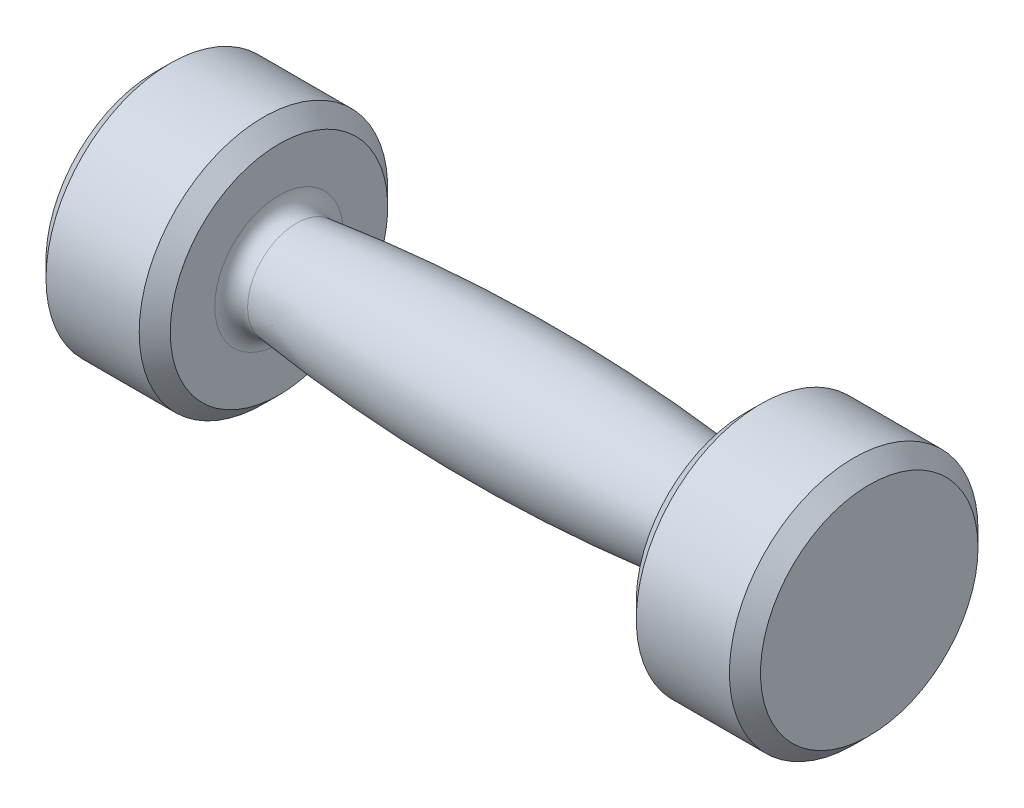
ISO-10303-21;
HEADER;
FILE_DESCRIPTION(('STEP AP214'),'2;1');
FILE_NAME('part.step','',(''),(''),'','','');
FILE_SCHEMA(('AUTOMOTIVE_DESIGN { 1 0 10303 214 1 1 1 1 }'));
ENDSEC;
DATA;
#1=APPLICATION_CONTEXT('core data for automotive mechanical design processes');
#2=APPLICATION_PROTOCOL_DEFINITION('international standard','automotive_design',2000,#1);
#3=PRODUCT_CONTEXT('',#1,'mechanical');
#4=PRODUCT('Part','Part','',(#3));
#5=PRODUCT_RELATED_PRODUCT_CATEGORY('part','',(#4));
#6=PRODUCT_DEFINITION_FORMATION('','',#4);
#7=PRODUCT_DEFINITION_CONTEXT('part definition',#1,'design');
#8=PRODUCT_DEFINITION('design','',#6,#7);
#9=PRODUCT_DEFINITION_SHAPE('','',#8);
#10=(LENGTH_UNIT() NAMED_UNIT(*) SI_UNIT(.MILLI.,.METRE.));
#11=(NAMED_UNIT(*) PLANE_ANGLE_UNIT() SI_UNIT($,.RADIAN.));
#12=(NAMED_UNIT(*) SI_UNIT($,.STERADIAN.) SOLID_ANGLE_UNIT());
#13=UNCERTAINTY_MEASURE_WITH_UNIT(LENGTH_MEASURE(1.E-05),#10,'distance_accuracy_value','');
#14=(GEOMETRIC_REPRESENTATION_CONTEXT(3) GLOBAL_UNCERTAINTY_ASSIGNED_CONTEXT((#13)) GLOBAL_UNIT_ASSIGNED_CONTEXT((#10,
#11,#12)) REPRESENTATION_CONTEXT('',''));
#15=CARTESIAN_POINT('',(0.,0.,0.));
#16=DIRECTION('',(0.,0.,1.));
#17=DIRECTION('',(1.,0.,0.));
#18=AXIS2_PLACEMENT_3D('',#15,#16,#17);
#19=CARTESIAN_POINT('',(75.,0.,0.));
#20=DIRECTION('',(1.,0.,0.));
#21=DIRECTION('',(0.,0.,-1.));
#22=AXIS2_PLACEMENT_3D('',#19,#20,#21);
#23=CYLINDRICAL_SURFACE('',#22,40.);
#24=CARTESIAN_POINT('',(110.,0.,0.));
#25=DIRECTION('',(1.,0.,0.));
#26=DIRECTION('',(0.,0.,-1.));
#27=AXIS2_PLACEMENT_3D('',#24,#25,#26);
#28=CIRCLE('',#27,40.);
#29=CARTESIAN_POINT('',(110.,0.,-40.));
#30=VERTEX_POINT('',#29);
#31=EDGE_CURVE('E59',#30,#30,#28,.F.);
#32=ORIENTED_EDGE('',*,*,#31,.T.);
#33=EDGE_LOOP('',(#32));
#34=FACE_BOUND('',#33,.T.);
#35=CARTESIAN_POINT('',(80.,0.,0.));
#36=DIRECTION('',(1.,0.,0.));
#37=DIRECTION('',(0.,0.,-1.));
#38=AXIS2_PLACEMENT_3D('',#35,#36,#37);
#39=CIRCLE('',#38,40.);
#40=CARTESIAN_POINT('',(80.,0.,-40.));
#41=VERTEX_POINT('',#40);
#42=EDGE_CURVE('E62',#41,#41,#39,.T.);
#43=ORIENTED_EDGE('',*,*,#42,.T.);
#44=EDGE_LOOP('',(#43));
#45=FACE_BOUND('',#44,.T.);
#46=ADVANCED_FACE('F35',(#34,#45),#23,.T.);
#47=CARTESIAN_POINT('',(75.,0.,0.));
#48=DIRECTION('',(1.,0.,0.));
#49=DIRECTION('',(0.,0.,-1.));
#50=AXIS2_PLACEMENT_3D('',#47,#48,#49);
#51=PLANE('',#50);
#52=CARTESIAN_POINT('',(75.,0.,0.));
#53=DIRECTION('',(1.,0.,0.));
#54=DIRECTION('',(0.,0.,-1.));
#55=AXIS2_PLACEMENT_3D('',#52,#53,#54);
#56=CIRCLE('',#55,35.);
#57=CARTESIAN_POINT('',(75.,0.,-35.));
#58=VERTEX_POINT('',#57);
#59=EDGE_CURVE('E56',#58,#58,#56,.F.);
#60=ORIENTED_EDGE('',*,*,#59,.T.);
#61=EDGE_LOOP('',(#60));
#62=FACE_BOUND('',#61,.T.);
#63=CARTESIAN_POINT('',(75.,0.,0.));
#64=DIRECTION('',(1.,0.,0.));
#65=DIRECTION('',(0.,0.,-1.));
#66=AXIS2_PLACEMENT_3D('',#63,#64,#65);
#67=CIRCLE('',#66,20.6854249492381);
#68=CARTESIAN_POINT('',(75.,0.,-20.6854249492381));
#69=VERTEX_POINT('',#68);
#70=EDGE_CURVE('E77',#69,#69,#67,.T.);
#71=ORIENTED_EDGE('',*,*,#70,.T.);
#72=EDGE_LOOP('',(#71));
#73=FACE_BOUND('',#72,.T.);
#74=ADVANCED_FACE('F81',(#62,#73),#51,.F.);
#75=CARTESIAN_POINT('',(115.,0.,0.));
#76=DIRECTION('',(1.,0.,0.));
#77=DIRECTION('',(0.,0.,-1.));
#78=AXIS2_PLACEMENT_3D('',#75,#76,#77);
#79=PLANE('',#78);
#80=CARTESIAN_POINT('',(115.,0.,0.));
#81=DIRECTION('',(1.,0.,0.));
#82=DIRECTION('',(0.,0.,-1.));
#83=AXIS2_PLACEMENT_3D('',#80,#81,#82);
#84=CIRCLE('',#83,35.);
#85=CARTESIAN_POINT('',(115.,0.,-35.));
#86=VERTEX_POINT('',#85);
#87=EDGE_CURVE('E65',#86,#86,#84,.T.);
#88=ORIENTED_EDGE('',*,*,#87,.T.);
#89=EDGE_LOOP('',(#88));
#90=FACE_BOUND('',#89,.T.);
#91=ADVANCED_FACE('F106',(#90),#79,.T.);
#92=CARTESIAN_POINT('',(0.,0.,0.));
#93=DIRECTION('',(1.,0.,0.));
#94=DIRECTION('',(0.,0.,-1.));
#95=AXIS2_PLACEMENT_3D('',#92,#93,#94);
#96=DEGENERATE_TOROIDAL_SURFACE('',#95,545.,565.,.F.);
#97=CARTESIAN_POINT('',(69.3859649122807,0.,0.));
#98=DIRECTION('',(-1.,0.,0.));
#99=DIRECTION('',(0.,0.,1.));
#100=AXIS2_PLACEMENT_3D('',#97,#98,#99);
#101=CIRCLE('',#100,15.7232720988061);
#102=CARTESIAN_POINT('',(69.3859649122807,0.,15.7232720988061));
#103=VERTEX_POINT('',#102);
#104=EDGE_CURVE('E71',#103,#103,#101,.T.);
#105=ORIENTED_EDGE('',*,*,#104,.T.);
#106=EDGE_LOOP('',(#105));
#107=FACE_BOUND('',#106,.T.);
#108=CARTESIAN_POINT('',(-69.3859649122807,0.,0.));
#109=DIRECTION('',(1.,0.,0.));
#110=DIRECTION('',(0.,0.,-1.));
#111=AXIS2_PLACEMENT_3D('',#108,#109,#110);
#112=CIRCLE('',#111,15.7232720988061);
#113=CARTESIAN_POINT('',(-69.3859649122807,0.,-15.7232720988061));
#114=VERTEX_POINT('',#113);
#115=EDGE_CURVE('E74',#114,#114,#112,.T.);
#116=ORIENTED_EDGE('',*,*,#115,.T.);
#117=EDGE_LOOP('',(#116));
#118=FACE_BOUND('',#117,.T.);
#119=ADVANCED_FACE('F113',(#107,#118),#96,.F.);
#120=CARTESIAN_POINT('',(-115.,0.,0.));
#121=DIRECTION('',(1.,0.,0.));
#122=DIRECTION('',(0.,0.,-1.));
#123=AXIS2_PLACEMENT_3D('',#120,#121,#122);
#124=PLANE('',#123);
#125=CARTESIAN_POINT('',(-115.,0.,0.));
#126=DIRECTION('',(1.,0.,0.));
#127=DIRECTION('',(0.,0.,-1.));
#128=AXIS2_PLACEMENT_3D('',#125,#126,#127);
#129=CIRCLE('',#128,35.);
#130=CARTESIAN_POINT('',(-115.,0.,-35.));
#131=VERTEX_POINT('',#130);
#132=EDGE_CURVE('E10',#131,#131,#129,.F.);
#133=ORIENTED_EDGE('',*,*,#132,.T.);
#134=EDGE_LOOP('',(#133));
#135=FACE_BOUND('',#134,.T.);
#136=ADVANCED_FACE('F115',(#135),#124,.F.);
#137=CARTESIAN_POINT('',(-75.,0.,0.));
#138=DIRECTION('',(-1.,0.,0.));
#139=DIRECTION('',(0.,0.,1.));
#140=AXIS2_PLACEMENT_3D('',#137,#138,#139);
#141=CYLINDRICAL_SURFACE('',#140,40.);
#142=CARTESIAN_POINT('',(-80.,0.,0.));
#143=DIRECTION('',(-1.,0.,0.));
#144=DIRECTION('',(0.,0.,1.));
#145=AXIS2_PLACEMENT_3D('',#142,#143,#144);
#146=CIRCLE('',#145,40.);
#147=CARTESIAN_POINT('',(-80.,0.,40.));
#148=VERTEX_POINT('',#147);
#149=EDGE_CURVE('E47',#148,#148,#146,.T.);
#150=ORIENTED_EDGE('',*,*,#149,.T.);
#151=EDGE_LOOP('',(#150));
#152=FACE_BOUND('',#151,.T.);
#153=CARTESIAN_POINT('',(-110.,0.,0.));
#154=DIRECTION('',(1.,0.,0.));
#155=DIRECTION('',(0.,0.,-1.));
#156=AXIS2_PLACEMENT_3D('',#153,#154,#155);
#157=CIRCLE('',#156,40.);
#158=CARTESIAN_POINT('',(-110.,0.,-40.));
#159=VERTEX_POINT('',#158);
#160=EDGE_CURVE('E51',#159,#159,#157,.T.);
#161=ORIENTED_EDGE('',*,*,#160,.T.);
#162=EDGE_LOOP('',(#161));
#163=FACE_BOUND('',#162,.T.);
#164=ADVANCED_FACE('F96',(#152,#163),#141,.T.);
#165=CARTESIAN_POINT('',(-75.,0.,0.));
#166=DIRECTION('',(-1.,0.,0.));
#167=DIRECTION('',(0.,0.,1.));
#168=AXIS2_PLACEMENT_3D('',#165,#166,#167);
#169=PLANE('',#168);
#170=CARTESIAN_POINT('',(-75.,0.,0.));
#171=DIRECTION('',(-1.,0.,0.));
#172=DIRECTION('',(0.,0.,1.));
#173=AXIS2_PLACEMENT_3D('',#170,#171,#172);
#174=CIRCLE('',#173,35.);
#175=CARTESIAN_POINT('',(-75.,0.,35.));
#176=VERTEX_POINT('',#175);
#177=EDGE_CURVE('E43',#176,#176,#174,.F.);
#178=ORIENTED_EDGE('',*,*,#177,.T.);
#179=EDGE_LOOP('',(#178));
#180=FACE_BOUND('',#179,.T.);
#181=CARTESIAN_POINT('',(-75.,0.,0.));
#182=DIRECTION('',(-1.,0.,0.));
#183=DIRECTION('',(0.,0.,1.));
#184=AXIS2_PLACEMENT_3D('',#181,#182,#183);
#185=CIRCLE('',#184,20.6854249492381);
#186=CARTESIAN_POINT('',(-75.,0.,20.6854249492381));
#187=VERTEX_POINT('',#186);
#188=EDGE_CURVE('E68',#187,#187,#185,.T.);
#189=ORIENTED_EDGE('',*,*,#188,.T.);
#190=EDGE_LOOP('',(#189));
#191=FACE_BOUND('',#190,.T.);
#192=ADVANCED_FACE('F86',(#180,#191),#169,.F.);
#193=CARTESIAN_POINT('',(70.,0.,0.));
#194=DIRECTION('',(1.,0.,0.));
#195=DIRECTION('',(0.,0.,-1.));
#196=AXIS2_PLACEMENT_3D('',#193,#194,#195);
#197=TOROIDAL_SURFACE('',#196,20.6854249492381,5.);
#198=ORIENTED_EDGE('',*,*,#104,.F.);
#199=EDGE_LOOP('',(#198));
#200=FACE_BOUND('',#199,.T.);
#201=ORIENTED_EDGE('',*,*,#70,.F.);
#202=EDGE_LOOP('',(#201));
#203=FACE_BOUND('',#202,.T.);
#204=ADVANCED_FACE('F83',(#200,#203),#197,.F.);
#205=CARTESIAN_POINT('',(-70.,0.,0.));
#206=DIRECTION('',(-1.,0.,0.));
#207=DIRECTION('',(0.,0.,1.));
#208=AXIS2_PLACEMENT_3D('',#205,#206,#207);
#209=TOROIDAL_SURFACE('',#208,20.6854249492381,5.);
#210=ORIENTED_EDGE('',*,*,#188,.F.);
#211=EDGE_LOOP('',(#210));
#212=FACE_BOUND('',#211,.T.);
#213=ORIENTED_EDGE('',*,*,#115,.F.);
#214=EDGE_LOOP('',(#213));
#215=FACE_BOUND('',#214,.T.);
#216=ADVANCED_FACE('F85',(#212,#215),#209,.F.);
#217=CARTESIAN_POINT('',(115.,0.,0.));
#218=DIRECTION('',(-1.,0.,0.));
#219=DIRECTION('',(0.,0.,1.));
#220=AXIS2_PLACEMENT_3D('',#217,#218,#219);
#221=CONICAL_SURFACE('',#220,35.,0.785398163397446);
#222=ORIENTED_EDGE('',*,*,#31,.F.);
#223=EDGE_LOOP('',(#222));
#224=FACE_BOUND('',#223,.T.);
#225=ORIENTED_EDGE('',*,*,#87,.F.);
#226=EDGE_LOOP('',(#225));
#227=FACE_BOUND('',#226,.T.);
#228=ADVANCED_FACE('F93',(#224,#227),#221,.T.);
#229=CARTESIAN_POINT('',(80.,0.,0.));
#230=DIRECTION('',(1.,0.,0.));
#231=DIRECTION('',(0.,0.,-1.));
#232=AXIS2_PLACEMENT_3D('',#229,#230,#231);
#233=CONICAL_SURFACE('',#232,40.,0.785398163397449);
#234=ORIENTED_EDGE('',*,*,#59,.F.);
#235=EDGE_LOOP('',(#234));
#236=FACE_BOUND('',#235,.T.);
#237=ORIENTED_EDGE('',*,*,#42,.F.);
#238=EDGE_LOOP('',(#237));
#239=FACE_BOUND('',#238,.T.);
#240=ADVANCED_FACE('F204',(#236,#239),#233,.T.);
#241=CARTESIAN_POINT('',(-80.,0.,0.));
#242=DIRECTION('',(-1.,0.,0.));
#243=DIRECTION('',(0.,0.,1.));
#244=AXIS2_PLACEMENT_3D('',#241,#242,#243);
#245=CONICAL_SURFACE('',#244,40.,0.785398163397449);
#246=ORIENTED_EDGE('',*,*,#177,.F.);
#247=EDGE_LOOP('',(#246));
#248=FACE_BOUND('',#247,.T.);
#249=ORIENTED_EDGE('',*,*,#149,.F.);
#250=EDGE_LOOP('',(#249));
#251=FACE_BOUND('',#250,.T.);
#252=ADVANCED_FACE('F215',(#248,#251),#245,.T.);
#253=CARTESIAN_POINT('',(-115.,0.,0.));
#254=DIRECTION('',(1.,0.,0.));
#255=DIRECTION('',(0.,0.,-1.));
#256=AXIS2_PLACEMENT_3D('',#253,#254,#255);
#257=CONICAL_SURFACE('',#256,35.,0.785398163397446);
#258=ORIENTED_EDGE('',*,*,#160,.F.);
#259=EDGE_LOOP('',(#258));
#260=FACE_BOUND('',#259,.T.);
#261=ORIENTED_EDGE('',*,*,#132,.F.);
#262=EDGE_LOOP('',(#261));
#263=FACE_BOUND('',#262,.T.);
#264=ADVANCED_FACE('F38',(#260,#263),#257,.T.);
#265=CLOSED_SHELL('',(#46,#74,#91,#119,#136,#164,#192,#204,#216,#228,#240,#252,#264));
#266=MANIFOLD_SOLID_BREP('B2',#265);
#267=ADVANCED_BREP_SHAPE_REPRESENTATION('',(#18,#266),#14);
#268=SHAPE_DEFINITION_REPRESENTATION(#9,#267);
ENDSEC;
END-ISO-10303-21;
